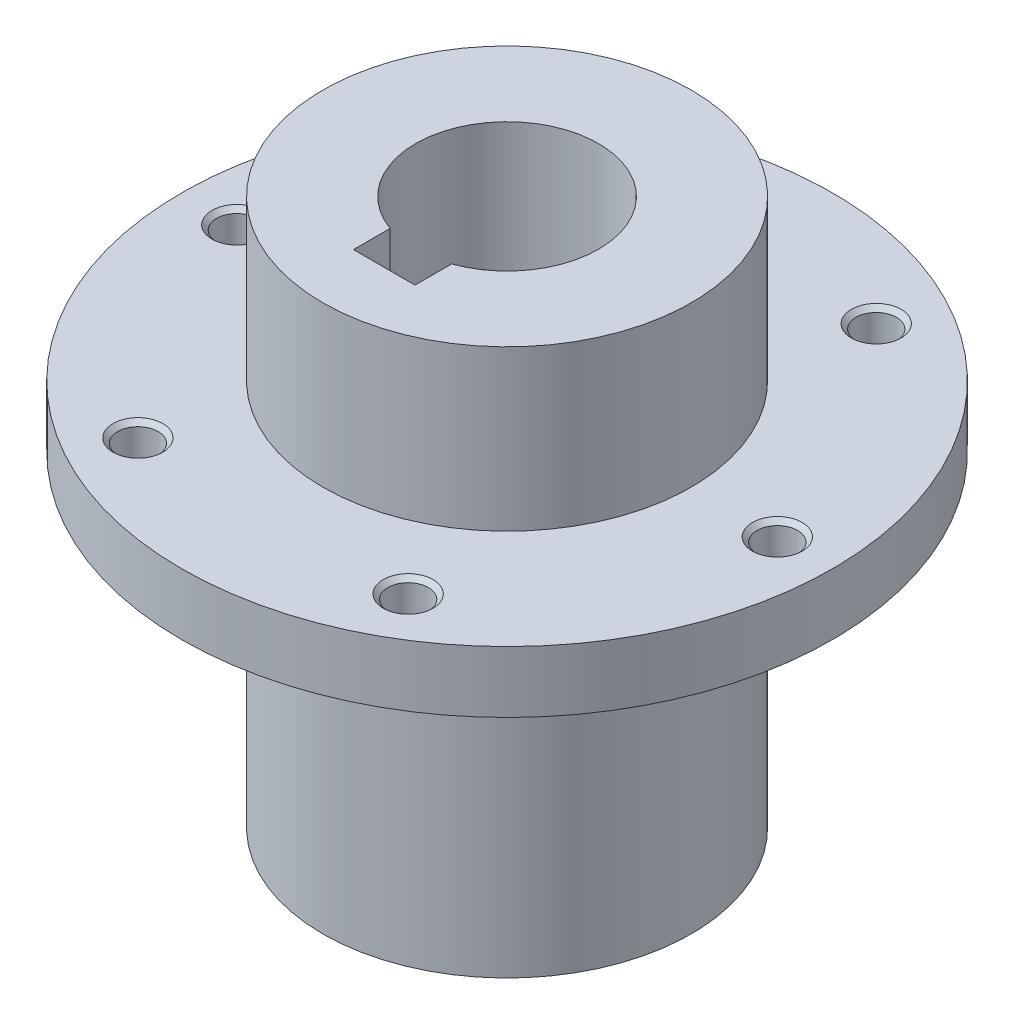
ISO-10303-21;
HEADER;
FILE_DESCRIPTION(('STEP AP214'),'2;1');
FILE_NAME('part.step','',(''),(''),'','','');
FILE_SCHEMA(('AUTOMOTIVE_DESIGN { 1 0 10303 214 1 1 1 1 }'));
ENDSEC;
DATA;
#1=APPLICATION_CONTEXT('core data for automotive mechanical design processes');
#2=APPLICATION_PROTOCOL_DEFINITION('international standard','automotive_design',2000,#1);
#3=PRODUCT_CONTEXT('',#1,'mechanical');
#4=PRODUCT('Part','Part','',(#3));
#5=PRODUCT_RELATED_PRODUCT_CATEGORY('part','',(#4));
#6=PRODUCT_DEFINITION_FORMATION('','',#4);
#7=PRODUCT_DEFINITION_CONTEXT('part definition',#1,'design');
#8=PRODUCT_DEFINITION('design','',#6,#7);
#9=PRODUCT_DEFINITION_SHAPE('','',#8);
#10=(LENGTH_UNIT() NAMED_UNIT(*) SI_UNIT(.MILLI.,.METRE.));
#11=(NAMED_UNIT(*) PLANE_ANGLE_UNIT() SI_UNIT($,.RADIAN.));
#12=(NAMED_UNIT(*) SI_UNIT($,.STERADIAN.) SOLID_ANGLE_UNIT());
#13=UNCERTAINTY_MEASURE_WITH_UNIT(LENGTH_MEASURE(1.E-05),#10,'distance_accuracy_value','');
#14=(GEOMETRIC_REPRESENTATION_CONTEXT(3) GLOBAL_UNCERTAINTY_ASSIGNED_CONTEXT((#13)) GLOBAL_UNIT_ASSIGNED_CONTEXT((#10,
#11,#12)) REPRESENTATION_CONTEXT('',''));
#15=CARTESIAN_POINT('',(0.,0.,0.));
#16=DIRECTION('',(0.,0.,1.));
#17=DIRECTION('',(1.,0.,0.));
#18=AXIS2_PLACEMENT_3D('',#15,#16,#17);
#19=CARTESIAN_POINT('',(0.,0.,0.));
#20=DIRECTION('',(0.,1.,0.));
#21=DIRECTION('',(0.,0.,1.));
#22=AXIS2_PLACEMENT_3D('',#19,#20,#21);
#23=PLANE('',#22);
#24=CARTESIAN_POINT('',(-10.9999999999998,0.,19.0525588832577));
#25=DIRECTION('',(0.,1.,0.));
#26=DIRECTION('',(0.,0.,1.));
#27=AXIS2_PLACEMENT_3D('',#24,#25,#26);
#28=CIRCLE('',#27,1.65);
#29=CARTESIAN_POINT('',(-10.9999999999998,0.,20.7025588832577));
#30=VERTEX_POINT('',#29);
#31=EDGE_CURVE('E120',#30,#30,#28,.F.);
#32=ORIENTED_EDGE('',*,*,#31,.F.);
#33=EDGE_LOOP('',(#32));
#34=FACE_BOUND('',#33,.T.);
#35=CARTESIAN_POINT('',(11.,0.,-19.0525588832577));
#36=DIRECTION('',(0.,1.,0.));
#37=DIRECTION('',(0.,0.,1.));
#38=AXIS2_PLACEMENT_3D('',#35,#36,#37);
#39=CIRCLE('',#38,1.65);
#40=CARTESIAN_POINT('',(11.,0.,-17.4025588832577));
#41=VERTEX_POINT('',#40);
#42=EDGE_CURVE('E147',#41,#41,#39,.F.);
#43=ORIENTED_EDGE('',*,*,#42,.F.);
#44=EDGE_LOOP('',(#43));
#45=FACE_BOUND('',#44,.T.);
#46=CARTESIAN_POINT('',(22.,0.,0.));
#47=DIRECTION('',(0.,1.,0.));
#48=DIRECTION('',(0.,0.,1.));
#49=AXIS2_PLACEMENT_3D('',#46,#47,#48);
#50=CIRCLE('',#49,1.65);
#51=CARTESIAN_POINT('',(22.,0.,1.65));
#52=VERTEX_POINT('',#51);
#53=EDGE_CURVE('E156',#52,#52,#50,.F.);
#54=ORIENTED_EDGE('',*,*,#53,.F.);
#55=EDGE_LOOP('',(#54));
#56=FACE_BOUND('',#55,.T.);
#57=CARTESIAN_POINT('',(0.,0.,0.));
#58=DIRECTION('',(0.,-1.,0.));
#59=DIRECTION('',(0.,0.,-1.));
#60=AXIS2_PLACEMENT_3D('',#57,#58,#59);
#61=CIRCLE('',#60,15.);
#62=CARTESIAN_POINT('',(0.,0.,-15.));
#63=VERTEX_POINT('',#62);
#64=EDGE_CURVE('E168',#63,#63,#61,.T.);
#65=ORIENTED_EDGE('',*,*,#64,.F.);
#66=EDGE_LOOP('',(#65));
#67=FACE_BOUND('',#66,.T.);
#68=CARTESIAN_POINT('',(0.,0.,0.));
#69=DIRECTION('',(0.,1.,0.));
#70=DIRECTION('',(0.,0.,1.));
#71=AXIS2_PLACEMENT_3D('',#68,#69,#70);
#72=CIRCLE('',#71,26.5);
#73=CARTESIAN_POINT('',(0.,0.,26.5));
#74=VERTEX_POINT('',#73);
#75=EDGE_CURVE('E174',#74,#74,#72,.T.);
#76=ORIENTED_EDGE('',*,*,#75,.F.);
#77=EDGE_LOOP('',(#76));
#78=FACE_BOUND('',#77,.T.);
#79=CARTESIAN_POINT('',(-11.0000000000001,0.,-19.0525588832576));
#80=DIRECTION('',(0.,1.,0.));
#81=DIRECTION('',(0.,0.,1.));
#82=AXIS2_PLACEMENT_3D('',#79,#80,#81);
#83=CIRCLE('',#82,1.65);
#84=CARTESIAN_POINT('',(-11.0000000000001,0.,-17.4025588832576));
#85=VERTEX_POINT('',#84);
#86=EDGE_CURVE('E138',#85,#85,#83,.F.);
#87=ORIENTED_EDGE('',*,*,#86,.F.);
#88=EDGE_LOOP('',(#87));
#89=FACE_BOUND('',#88,.T.);
#90=CARTESIAN_POINT('',(-22.,0.,0.));
#91=DIRECTION('',(0.,1.,0.));
#92=DIRECTION('',(0.,0.,1.));
#93=AXIS2_PLACEMENT_3D('',#90,#91,#92);
#94=CIRCLE('',#93,1.65);
#95=CARTESIAN_POINT('',(-22.,0.,1.65));
#96=VERTEX_POINT('',#95);
#97=EDGE_CURVE('E129',#96,#96,#94,.F.);
#98=ORIENTED_EDGE('',*,*,#97,.F.);
#99=EDGE_LOOP('',(#98));
#100=FACE_BOUND('',#99,.T.);
#101=CARTESIAN_POINT('',(11.0000000000002,0.,19.0525588832575));
#102=DIRECTION('',(0.,1.,0.));
#103=DIRECTION('',(0.,0.,1.));
#104=AXIS2_PLACEMENT_3D('',#101,#102,#103);
#105=CIRCLE('',#104,1.65);
#106=CARTESIAN_POINT('',(11.0000000000002,0.,20.7025588832575));
#107=VERTEX_POINT('',#106);
#108=EDGE_CURVE('E111',#107,#107,#105,.F.);
#109=ORIENTED_EDGE('',*,*,#108,.F.);
#110=EDGE_LOOP('',(#109));
#111=FACE_BOUND('',#110,.T.);
#112=ADVANCED_FACE('F38',(#34,#45,#56,#67,#78,#89,#100,#111),#23,.F.);
#113=CARTESIAN_POINT('',(0.,5.,0.));
#114=DIRECTION('',(0.,-1.,0.));
#115=DIRECTION('',(0.,0.,-1.));
#116=AXIS2_PLACEMENT_3D('',#113,#114,#115);
#117=CYLINDRICAL_SURFACE('',#116,26.5);
#118=CARTESIAN_POINT('',(0.,5.,0.));
#119=DIRECTION('',(0.,1.,0.));
#120=DIRECTION('',(0.,0.,1.));
#121=AXIS2_PLACEMENT_3D('',#118,#119,#120);
#122=CIRCLE('',#121,26.5);
#123=CARTESIAN_POINT('',(0.,5.,26.5));
#124=VERTEX_POINT('',#123);
#125=EDGE_CURVE('E177',#124,#124,#122,.T.);
#126=ORIENTED_EDGE('',*,*,#125,.F.);
#127=EDGE_LOOP('',(#126));
#128=FACE_BOUND('',#127,.T.);
#129=ORIENTED_EDGE('',*,*,#75,.T.);
#130=EDGE_LOOP('',(#129));
#131=FACE_BOUND('',#130,.T.);
#132=ADVANCED_FACE('F40',(#128,#131),#117,.T.);
#133=CARTESIAN_POINT('',(0.,5.,0.));
#134=DIRECTION('',(0.,1.,0.));
#135=DIRECTION('',(0.,0.,1.));
#136=AXIS2_PLACEMENT_3D('',#133,#134,#135);
#137=PLANE('',#136);
#138=CARTESIAN_POINT('',(11.0000000000002,5.,19.0525588832575));
#139=DIRECTION('',(0.,1.,0.));
#140=DIRECTION('',(0.,0.,1.));
#141=AXIS2_PLACEMENT_3D('',#138,#139,#140);
#142=CIRCLE('',#141,2.025);
#143=CARTESIAN_POINT('',(11.0000000000002,5.,21.0775588832575));
#144=VERTEX_POINT('',#143);
#145=EDGE_CURVE('E110',#144,#144,#142,.T.);
#146=ORIENTED_EDGE('',*,*,#145,.F.);
#147=EDGE_LOOP('',(#146));
#148=FACE_BOUND('',#147,.T.);
#149=CARTESIAN_POINT('',(-10.9999999999998,5.,19.0525588832577));
#150=DIRECTION('',(0.,1.,0.));
#151=DIRECTION('',(0.,0.,1.));
#152=AXIS2_PLACEMENT_3D('',#149,#150,#151);
#153=CIRCLE('',#152,2.025);
#154=CARTESIAN_POINT('',(-10.9999999999998,5.,21.0775588832577));
#155=VERTEX_POINT('',#154);
#156=EDGE_CURVE('E114',#155,#155,#153,.T.);
#157=ORIENTED_EDGE('',*,*,#156,.F.);
#158=EDGE_LOOP('',(#157));
#159=FACE_BOUND('',#158,.T.);
#160=CARTESIAN_POINT('',(-22.,5.,0.));
#161=DIRECTION('',(0.,1.,0.));
#162=DIRECTION('',(0.,0.,1.));
#163=AXIS2_PLACEMENT_3D('',#160,#161,#162);
#164=CIRCLE('',#163,2.025);
#165=CARTESIAN_POINT('',(-22.,5.,2.025));
#166=VERTEX_POINT('',#165);
#167=EDGE_CURVE('E123',#166,#166,#164,.T.);
#168=ORIENTED_EDGE('',*,*,#167,.F.);
#169=EDGE_LOOP('',(#168));
#170=FACE_BOUND('',#169,.T.);
#171=CARTESIAN_POINT('',(-11.0000000000001,5.,-19.0525588832576));
#172=DIRECTION('',(0.,1.,0.));
#173=DIRECTION('',(0.,0.,1.));
#174=AXIS2_PLACEMENT_3D('',#171,#172,#173);
#175=CIRCLE('',#174,2.025);
#176=CARTESIAN_POINT('',(-11.0000000000001,5.,-17.0275588832576));
#177=VERTEX_POINT('',#176);
#178=EDGE_CURVE('E132',#177,#177,#175,.T.);
#179=ORIENTED_EDGE('',*,*,#178,.F.);
#180=EDGE_LOOP('',(#179));
#181=FACE_BOUND('',#180,.T.);
#182=CARTESIAN_POINT('',(11.,5.,-19.0525588832577));
#183=DIRECTION('',(0.,1.,0.));
#184=DIRECTION('',(0.,0.,1.));
#185=AXIS2_PLACEMENT_3D('',#182,#183,#184);
#186=CIRCLE('',#185,2.025);
#187=CARTESIAN_POINT('',(11.,5.,-17.0275588832577));
#188=VERTEX_POINT('',#187);
#189=EDGE_CURVE('E141',#188,#188,#186,.T.);
#190=ORIENTED_EDGE('',*,*,#189,.F.);
#191=EDGE_LOOP('',(#190));
#192=FACE_BOUND('',#191,.T.);
#193=CARTESIAN_POINT('',(22.,5.,0.));
#194=DIRECTION('',(0.,1.,0.));
#195=DIRECTION('',(0.,0.,1.));
#196=AXIS2_PLACEMENT_3D('',#193,#194,#195);
#197=CIRCLE('',#196,2.025);
#198=CARTESIAN_POINT('',(22.,5.,2.025));
#199=VERTEX_POINT('',#198);
#200=EDGE_CURVE('E150',#199,#199,#197,.T.);
#201=ORIENTED_EDGE('',*,*,#200,.F.);
#202=EDGE_LOOP('',(#201));
#203=FACE_BOUND('',#202,.T.);
#204=CARTESIAN_POINT('',(0.,5.,0.));
#205=DIRECTION('',(0.,1.,0.));
#206=DIRECTION('',(0.,0.,1.));
#207=AXIS2_PLACEMENT_3D('',#204,#205,#206);
#208=CIRCLE('',#207,15.);
#209=CARTESIAN_POINT('',(0.,5.,-15.));
#210=VERTEX_POINT('',#209);
#211=EDGE_CURVE('E171',#210,#210,#208,.T.);
#212=ORIENTED_EDGE('',*,*,#211,.F.);
#213=EDGE_LOOP('',(#212));
#214=FACE_BOUND('',#213,.T.);
#215=ORIENTED_EDGE('',*,*,#125,.T.);
#216=EDGE_LOOP('',(#215));
#217=FACE_BOUND('',#216,.T.);
#218=ADVANCED_FACE('F197',(#148,#159,#170,#181,#192,#203,#214,#217),#137,.T.);
#219=CARTESIAN_POINT('',(0.,18.,0.));
#220=DIRECTION('',(0.,-1.,0.));
#221=DIRECTION('',(0.,0.,-1.));
#222=AXIS2_PLACEMENT_3D('',#219,#220,#221);
#223=CYLINDRICAL_SURFACE('',#222,15.);
#224=CARTESIAN_POINT('',(0.,18.,0.));
#225=DIRECTION('',(0.,1.,0.));
#226=DIRECTION('',(0.,0.,1.));
#227=AXIS2_PLACEMENT_3D('',#224,#225,#226);
#228=CIRCLE('',#227,15.);
#229=CARTESIAN_POINT('',(0.,18.,-15.));
#230=VERTEX_POINT('',#229);
#231=EDGE_CURVE('E167',#230,#230,#228,.T.);
#232=CARTESIAN_POINT('',(0.,18.,-15.));
#233=CARTESIAN_POINT('',(0.,17.8645833333333,-15.));
#234=CARTESIAN_POINT('',(0.,17.7291666666667,-15.));
#235=CARTESIAN_POINT('',(0.,17.4583333333333,-15.));
#236=CARTESIAN_POINT('',(0.,17.3229166666667,-15.));
#237=CARTESIAN_POINT('',(0.,17.0520833333333,-15.));
#238=CARTESIAN_POINT('',(0.,16.9166666666667,-15.));
#239=CARTESIAN_POINT('',(0.,16.6458333333333,-15.));
#240=CARTESIAN_POINT('',(0.,16.5104166666667,-15.));
#241=CARTESIAN_POINT('',(0.,16.2395833333333,-15.));
#242=CARTESIAN_POINT('',(0.,16.1041666666667,-15.));
#243=CARTESIAN_POINT('',(0.,15.8333333333333,-15.));
#244=CARTESIAN_POINT('',(0.,15.6979166666667,-15.));
#245=CARTESIAN_POINT('',(0.,15.4270833333333,-15.));
#246=CARTESIAN_POINT('',(0.,15.2916666666667,-15.));
#247=CARTESIAN_POINT('',(0.,15.0208333333333,-15.));
#248=CARTESIAN_POINT('',(0.,14.8854166666667,-15.));
#249=CARTESIAN_POINT('',(0.,14.6145833333333,-15.));
#250=CARTESIAN_POINT('',(0.,14.4791666666667,-15.));
#251=CARTESIAN_POINT('',(0.,14.2083333333333,-15.));
#252=CARTESIAN_POINT('',(0.,14.0729166666667,-15.));
#253=CARTESIAN_POINT('',(0.,13.8020833333333,-15.));
#254=CARTESIAN_POINT('',(0.,13.6666666666667,-15.));
#255=CARTESIAN_POINT('',(0.,13.3958333333333,-15.));
#256=CARTESIAN_POINT('',(0.,13.2604166666667,-15.));
#257=CARTESIAN_POINT('',(0.,12.9895833333333,-15.));
#258=CARTESIAN_POINT('',(0.,12.8541666666667,-15.));
#259=CARTESIAN_POINT('',(0.,12.5833333333333,-15.));
#260=CARTESIAN_POINT('',(0.,12.4479166666667,-15.));
#261=CARTESIAN_POINT('',(0.,12.1770833333333,-15.));
#262=CARTESIAN_POINT('',(0.,12.0416666666667,-15.));
#263=CARTESIAN_POINT('',(0.,11.7708333333333,-15.));
#264=CARTESIAN_POINT('',(0.,11.6354166666667,-15.));
#265=CARTESIAN_POINT('',(0.,11.3645833333333,-15.));
#266=CARTESIAN_POINT('',(0.,11.2291666666667,-15.));
#267=CARTESIAN_POINT('',(0.,10.9583333333333,-15.));
#268=CARTESIAN_POINT('',(0.,10.8229166666667,-15.));
#269=CARTESIAN_POINT('',(0.,10.5520833333333,-15.));
#270=CARTESIAN_POINT('',(0.,10.4166666666667,-15.));
#271=CARTESIAN_POINT('',(0.,10.1458333333333,-15.));
#272=CARTESIAN_POINT('',(0.,10.0104166666667,-15.));
#273=CARTESIAN_POINT('',(0.,9.73958333333333,-15.));
#274=CARTESIAN_POINT('',(0.,9.60416666666667,-15.));
#275=CARTESIAN_POINT('',(0.,9.33333333333333,-15.));
#276=CARTESIAN_POINT('',(0.,9.19791666666667,-15.));
#277=CARTESIAN_POINT('',(0.,8.92708333333333,-15.));
#278=CARTESIAN_POINT('',(0.,8.79166666666667,-15.));
#279=CARTESIAN_POINT('',(0.,8.52083333333333,-15.));
#280=CARTESIAN_POINT('',(0.,8.38541666666667,-15.));
#281=CARTESIAN_POINT('',(0.,8.11458333333333,-15.));
#282=CARTESIAN_POINT('',(0.,7.97916666666667,-15.));
#283=CARTESIAN_POINT('',(0.,7.70833333333333,-15.));
#284=CARTESIAN_POINT('',(0.,7.57291666666667,-15.));
#285=CARTESIAN_POINT('',(0.,7.30208333333333,-15.));
#286=CARTESIAN_POINT('',(0.,7.16666666666667,-15.));
#287=CARTESIAN_POINT('',(0.,6.89583333333333,-15.));
#288=CARTESIAN_POINT('',(0.,6.76041666666667,-15.));
#289=CARTESIAN_POINT('',(0.,6.48958333333333,-15.));
#290=CARTESIAN_POINT('',(0.,6.35416666666667,-15.));
#291=CARTESIAN_POINT('',(0.,6.08333333333333,-15.));
#292=CARTESIAN_POINT('',(0.,5.94791666666667,-15.));
#293=CARTESIAN_POINT('',(0.,5.67708333333333,-15.));
#294=CARTESIAN_POINT('',(0.,5.54166666666667,-15.));
#295=CARTESIAN_POINT('',(0.,5.27083333333333,-15.));
#296=CARTESIAN_POINT('',(0.,5.13541666666667,-15.));
#297=CARTESIAN_POINT('',(0.,5.,-15.));
#298=B_SPLINE_CURVE_WITH_KNOTS('',3,(#232,#233,#234,#235,#236,#237,#238,#239,#240,#241,#242,
#243,#244,#245,#246,#247,#248,#249,#250,#251,#252,#253,#254,#255,#256,#257,#258,#259,#260,#261,
#262,#263,#264,#265,#266,#267,#268,#269,#270,#271,#272,#273,#274,#275,#276,#277,#278,#279,#280,
#281,#282,#283,#284,#285,#286,#287,#288,#289,#290,#291,#292,#293,#294,#295,#296,#297),
.UNSPECIFIED.,.F.,.F.,(4,2,2,2,2,2,2,2,2,2,2,2,2,2,2,2,2,2,2,2,2,2,2,2,2,2,2,2,2,2,2,2,4),(0.,
0.40625,0.812500000000001,1.21875,1.625,2.03125,2.4375,2.84375,3.25,3.65625,4.0625,4.46875,
4.875,5.28125,5.6875,6.09375,6.5,6.90625,7.3125,7.71875,8.125,8.53125,8.9375,9.34375,9.75,
10.15625,10.5625,10.96875,11.375,11.78125,12.1875,12.59375,13.),.UNSPECIFIED.);
#299=EDGE_CURVE('BSEAM191',#230,#210,#298,.T.);
#300=ORIENTED_EDGE('',*,*,#231,.F.);
#301=ORIENTED_EDGE('',*,*,#211,.T.);
#302=ORIENTED_EDGE('',*,*,#299,.T.);
#303=ORIENTED_EDGE('',*,*,#299,.F.);
#304=EDGE_LOOP('',(#300,#302,#301,#303));
#305=FACE_BOUND('',#304,.T.);
#306=ADVANCED_FACE('F191',(#305),#223,.T.);
#307=CARTESIAN_POINT('',(0.,18.,0.));
#308=DIRECTION('',(0.,1.,0.));
#309=DIRECTION('',(0.,0.,1.));
#310=AXIS2_PLACEMENT_3D('',#307,#308,#309);
#311=PLANE('',#310);
#312=DIRECTION('',(0.,0.,-1.));
#313=VECTOR('',#312,1.);
#314=CARTESIAN_POINT('',(2.505,18.,10.));
#315=LINE('',#314,#313);
#316=CARTESIAN_POINT('',(2.505,18.,10.));
#317=VERTEX_POINT('',#316);
#318=CARTESIAN_POINT('',(2.505,18.,7.0162294004686));
#319=VERTEX_POINT('',#318);
#320=EDGE_CURVE('E61',#317,#319,#315,.T.);
#321=ORIENTED_EDGE('',*,*,#320,.F.);
#322=DIRECTION('',(1.,0.,0.));
#323=VECTOR('',#322,1.);
#324=CARTESIAN_POINT('',(-2.505,18.,10.));
#325=LINE('',#324,#323);
#326=CARTESIAN_POINT('',(-2.505,18.,10.));
#327=VERTEX_POINT('',#326);
#328=EDGE_CURVE('E92',#327,#317,#325,.T.);
#329=ORIENTED_EDGE('',*,*,#328,.F.);
#330=DIRECTION('',(0.,0.,1.));
#331=VECTOR('',#330,1.);
#332=CARTESIAN_POINT('',(-2.505,18.,10.));
#333=LINE('',#332,#331);
#334=CARTESIAN_POINT('',(-2.505,18.,7.0162294004686));
#335=VERTEX_POINT('',#334);
#336=EDGE_CURVE('E100',#335,#327,#333,.T.);
#337=ORIENTED_EDGE('',*,*,#336,.F.);
#338=CARTESIAN_POINT('',(0.,18.,0.));
#339=DIRECTION('',(0.,1.,0.));
#340=DIRECTION('',(0.,0.,1.));
#341=AXIS2_PLACEMENT_3D('',#338,#339,#340);
#342=CIRCLE('',#341,7.45);
#343=EDGE_CURVE('E105',#319,#335,#342,.T.);
#344=ORIENTED_EDGE('',*,*,#343,.F.);
#345=EDGE_LOOP('',(#321,#329,#337,#344));
#346=FACE_BOUND('',#345,.T.);
#347=ORIENTED_EDGE('',*,*,#231,.T.);
#348=EDGE_LOOP('',(#347));
#349=FACE_BOUND('',#348,.T.);
#350=ADVANCED_FACE('F187',(#346,#349),#311,.T.);
#351=CARTESIAN_POINT('',(0.,-26.5,0.));
#352=DIRECTION('',(0.,1.,0.));
#353=DIRECTION('',(0.,0.,1.));
#354=AXIS2_PLACEMENT_3D('',#351,#352,#353);
#355=CYLINDRICAL_SURFACE('',#354,15.);
#356=CARTESIAN_POINT('',(0.,-26.5,0.));
#357=DIRECTION('',(0.,-1.,0.));
#358=DIRECTION('',(0.,0.,-1.));
#359=AXIS2_PLACEMENT_3D('',#356,#357,#358);
#360=CIRCLE('',#359,15.);
#361=CARTESIAN_POINT('',(0.,-26.5,-15.));
#362=VERTEX_POINT('',#361);
#363=EDGE_CURVE('E159',#362,#362,#360,.T.);
#364=ORIENTED_EDGE('',*,*,#363,.F.);
#365=EDGE_LOOP('',(#364));
#366=FACE_BOUND('',#365,.T.);
#367=ORIENTED_EDGE('',*,*,#64,.T.);
#368=EDGE_LOOP('',(#367));
#369=FACE_BOUND('',#368,.T.);
#370=ADVANCED_FACE('F190',(#366,#369),#355,.T.);
#371=CARTESIAN_POINT('',(0.,-26.5,0.));
#372=DIRECTION('',(0.,-1.,0.));
#373=DIRECTION('',(0.,0.,-1.));
#374=AXIS2_PLACEMENT_3D('',#371,#372,#373);
#375=PLANE('',#374);
#376=DIRECTION('',(0.,0.,-1.));
#377=VECTOR('',#376,1.);
#378=CARTESIAN_POINT('',(2.505,-26.5,10.));
#379=LINE('',#378,#377);
#380=CARTESIAN_POINT('',(2.505,-26.5,10.));
#381=VERTEX_POINT('',#380);
#382=CARTESIAN_POINT('',(2.505,-26.5,7.0162294004686));
#383=VERTEX_POINT('',#382);
#384=EDGE_CURVE('E77',#381,#383,#379,.T.);
#385=ORIENTED_EDGE('',*,*,#384,.T.);
#386=CARTESIAN_POINT('',(0.,-26.5,0.));
#387=DIRECTION('',(0.,-1.,0.));
#388=DIRECTION('',(0.,0.,-1.));
#389=AXIS2_PLACEMENT_3D('',#386,#387,#388);
#390=CIRCLE('',#389,7.45);
#391=CARTESIAN_POINT('',(-2.505,-26.5,7.0162294004686));
#392=VERTEX_POINT('',#391);
#393=EDGE_CURVE('E108',#383,#392,#390,.F.);
#394=ORIENTED_EDGE('',*,*,#393,.T.);
#395=DIRECTION('',(0.,0.,1.));
#396=VECTOR('',#395,1.);
#397=CARTESIAN_POINT('',(-2.505,-26.5,10.));
#398=LINE('',#397,#396);
#399=CARTESIAN_POINT('',(-2.505,-26.5,10.));
#400=VERTEX_POINT('',#399);
#401=EDGE_CURVE('E53',#392,#400,#398,.T.);
#402=ORIENTED_EDGE('',*,*,#401,.T.);
#403=DIRECTION('',(1.,0.,0.));
#404=VECTOR('',#403,1.);
#405=CARTESIAN_POINT('',(-2.505,-26.5,10.));
#406=LINE('',#405,#404);
#407=EDGE_CURVE('E90',#400,#381,#406,.T.);
#408=ORIENTED_EDGE('',*,*,#407,.T.);
#409=EDGE_LOOP('',(#385,#394,#402,#408));
#410=FACE_BOUND('',#409,.T.);
#411=ORIENTED_EDGE('',*,*,#363,.T.);
#412=EDGE_LOOP('',(#411));
#413=FACE_BOUND('',#412,.T.);
#414=ADVANCED_FACE('F94',(#410,#413),#375,.T.);
#415=CARTESIAN_POINT('',(22.,5.,0.));
#416=DIRECTION('',(0.,1.,0.));
#417=DIRECTION('',(0.,0.,1.));
#418=AXIS2_PLACEMENT_3D('',#415,#416,#417);
#419=CYLINDRICAL_SURFACE('',#418,1.65);
#420=ORIENTED_EDGE('',*,*,#53,.T.);
#421=EDGE_LOOP('',(#420));
#422=FACE_BOUND('',#421,.T.);
#423=CARTESIAN_POINT('',(22.,4.625,0.));
#424=DIRECTION('',(0.,1.,0.));
#425=DIRECTION('',(0.,0.,1.));
#426=AXIS2_PLACEMENT_3D('',#423,#424,#425);
#427=CIRCLE('',#426,1.65);
#428=CARTESIAN_POINT('',(22.,4.625,1.65));
#429=VERTEX_POINT('',#428);
#430=EDGE_CURVE('E160',#429,#429,#427,.T.);
#431=ORIENTED_EDGE('',*,*,#430,.T.);
#432=EDGE_LOOP('',(#431));
#433=FACE_BOUND('',#432,.T.);
#434=ADVANCED_FACE('F246',(#422,#433),#419,.F.);
#435=CARTESIAN_POINT('',(22.,5.,0.));
#436=DIRECTION('',(0.,1.,0.));
#437=DIRECTION('',(0.,0.,1.));
#438=AXIS2_PLACEMENT_3D('',#435,#436,#437);
#439=CONICAL_SURFACE('',#438,2.025,0.78539816339745);
#440=ORIENTED_EDGE('',*,*,#430,.F.);
#441=EDGE_LOOP('',(#440));
#442=FACE_BOUND('',#441,.T.);
#443=ORIENTED_EDGE('',*,*,#200,.T.);
#444=EDGE_LOOP('',(#443));
#445=FACE_BOUND('',#444,.T.);
#446=ADVANCED_FACE('F243',(#442,#445),#439,.F.);
#447=CARTESIAN_POINT('',(11.,5.,-19.0525588832577));
#448=DIRECTION('',(0.,1.,0.));
#449=DIRECTION('',(0.,0.,1.));
#450=AXIS2_PLACEMENT_3D('',#447,#448,#449);
#451=CYLINDRICAL_SURFACE('',#450,1.65);
#452=ORIENTED_EDGE('',*,*,#42,.T.);
#453=EDGE_LOOP('',(#452));
#454=FACE_BOUND('',#453,.T.);
#455=CARTESIAN_POINT('',(11.,4.625,-19.0525588832577));
#456=DIRECTION('',(0.,1.,0.));
#457=DIRECTION('',(0.,0.,1.));
#458=AXIS2_PLACEMENT_3D('',#455,#456,#457);
#459=CIRCLE('',#458,1.65);
#460=CARTESIAN_POINT('',(11.,4.625,-17.4025588832577));
#461=VERTEX_POINT('',#460);
#462=EDGE_CURVE('E151',#461,#461,#459,.T.);
#463=ORIENTED_EDGE('',*,*,#462,.T.);
#464=EDGE_LOOP('',(#463));
#465=FACE_BOUND('',#464,.T.);
#466=ADVANCED_FACE('F245',(#454,#465),#451,.F.);
#467=CARTESIAN_POINT('',(11.,5.,-19.0525588832577));
#468=DIRECTION('',(0.,1.,0.));
#469=DIRECTION('',(0.,0.,1.));
#470=AXIS2_PLACEMENT_3D('',#467,#468,#469);
#471=CONICAL_SURFACE('',#470,2.025,0.78539816339745);
#472=ORIENTED_EDGE('',*,*,#462,.F.);
#473=EDGE_LOOP('',(#472));
#474=FACE_BOUND('',#473,.T.);
#475=ORIENTED_EDGE('',*,*,#189,.T.);
#476=EDGE_LOOP('',(#475));
#477=FACE_BOUND('',#476,.T.);
#478=ADVANCED_FACE('F253',(#474,#477),#471,.F.);
#479=CARTESIAN_POINT('',(-11.0000000000001,5.,-19.0525588832576));
#480=DIRECTION('',(0.,1.,0.));
#481=DIRECTION('',(0.,0.,1.));
#482=AXIS2_PLACEMENT_3D('',#479,#480,#481);
#483=CYLINDRICAL_SURFACE('',#482,1.65);
#484=ORIENTED_EDGE('',*,*,#86,.T.);
#485=EDGE_LOOP('',(#484));
#486=FACE_BOUND('',#485,.T.);
#487=CARTESIAN_POINT('',(-11.0000000000001,4.625,-19.0525588832576));
#488=DIRECTION('',(0.,1.,0.));
#489=DIRECTION('',(0.,0.,1.));
#490=AXIS2_PLACEMENT_3D('',#487,#488,#489);
#491=CIRCLE('',#490,1.65);
#492=CARTESIAN_POINT('',(-11.0000000000001,4.625,-17.4025588832576));
#493=VERTEX_POINT('',#492);
#494=EDGE_CURVE('E142',#493,#493,#491,.T.);
#495=ORIENTED_EDGE('',*,*,#494,.T.);
#496=EDGE_LOOP('',(#495));
#497=FACE_BOUND('',#496,.T.);
#498=ADVANCED_FACE('F330',(#486,#497),#483,.F.);
#499=CARTESIAN_POINT('',(-11.0000000000001,5.,-19.0525588832576));
#500=DIRECTION('',(0.,1.,0.));
#501=DIRECTION('',(0.,0.,1.));
#502=AXIS2_PLACEMENT_3D('',#499,#500,#501);
#503=CONICAL_SURFACE('',#502,2.025,0.785398163397452);
#504=ORIENTED_EDGE('',*,*,#494,.F.);
#505=EDGE_LOOP('',(#504));
#506=FACE_BOUND('',#505,.T.);
#507=ORIENTED_EDGE('',*,*,#178,.T.);
#508=EDGE_LOOP('',(#507));
#509=FACE_BOUND('',#508,.T.);
#510=ADVANCED_FACE('F335',(#506,#509),#503,.F.);
#511=CARTESIAN_POINT('',(-22.,5.,0.));
#512=DIRECTION('',(0.,1.,0.));
#513=DIRECTION('',(0.,0.,1.));
#514=AXIS2_PLACEMENT_3D('',#511,#512,#513);
#515=CYLINDRICAL_SURFACE('',#514,1.65);
#516=ORIENTED_EDGE('',*,*,#97,.T.);
#517=EDGE_LOOP('',(#516));
#518=FACE_BOUND('',#517,.T.);
#519=CARTESIAN_POINT('',(-22.,4.625,0.));
#520=DIRECTION('',(0.,1.,0.));
#521=DIRECTION('',(0.,0.,1.));
#522=AXIS2_PLACEMENT_3D('',#519,#520,#521);
#523=CIRCLE('',#522,1.65);
#524=CARTESIAN_POINT('',(-22.,4.625,1.65));
#525=VERTEX_POINT('',#524);
#526=EDGE_CURVE('E133',#525,#525,#523,.T.);
#527=ORIENTED_EDGE('',*,*,#526,.T.);
#528=EDGE_LOOP('',(#527));
#529=FACE_BOUND('',#528,.T.);
#530=ADVANCED_FACE('F342',(#518,#529),#515,.F.);
#531=CARTESIAN_POINT('',(-22.,5.,0.));
#532=DIRECTION('',(0.,1.,0.));
#533=DIRECTION('',(0.,0.,1.));
#534=AXIS2_PLACEMENT_3D('',#531,#532,#533);
#535=CONICAL_SURFACE('',#534,2.025,0.78539816339745);
#536=ORIENTED_EDGE('',*,*,#526,.F.);
#537=EDGE_LOOP('',(#536));
#538=FACE_BOUND('',#537,.T.);
#539=ORIENTED_EDGE('',*,*,#167,.T.);
#540=EDGE_LOOP('',(#539));
#541=FACE_BOUND('',#540,.T.);
#542=ADVANCED_FACE('F317',(#538,#541),#535,.F.);
#543=CARTESIAN_POINT('',(-10.9999999999998,5.,19.0525588832577));
#544=DIRECTION('',(0.,1.,0.));
#545=DIRECTION('',(0.,0.,1.));
#546=AXIS2_PLACEMENT_3D('',#543,#544,#545);
#547=CYLINDRICAL_SURFACE('',#546,1.65);
#548=ORIENTED_EDGE('',*,*,#31,.T.);
#549=EDGE_LOOP('',(#548));
#550=FACE_BOUND('',#549,.T.);
#551=CARTESIAN_POINT('',(-10.9999999999998,4.625,19.0525588832577));
#552=DIRECTION('',(0.,1.,0.));
#553=DIRECTION('',(0.,0.,1.));
#554=AXIS2_PLACEMENT_3D('',#551,#552,#553);
#555=CIRCLE('',#554,1.65);
#556=CARTESIAN_POINT('',(-10.9999999999998,4.625,20.7025588832577));
#557=VERTEX_POINT('',#556);
#558=EDGE_CURVE('E124',#557,#557,#555,.T.);
#559=ORIENTED_EDGE('',*,*,#558,.T.);
#560=EDGE_LOOP('',(#559));
#561=FACE_BOUND('',#560,.T.);
#562=ADVANCED_FACE('F306',(#550,#561),#547,.F.);
#563=CARTESIAN_POINT('',(-10.9999999999998,5.,19.0525588832577));
#564=DIRECTION('',(0.,1.,0.));
#565=DIRECTION('',(0.,0.,1.));
#566=AXIS2_PLACEMENT_3D('',#563,#564,#565);
#567=CONICAL_SURFACE('',#566,2.025,0.785398163397452);
#568=ORIENTED_EDGE('',*,*,#558,.F.);
#569=EDGE_LOOP('',(#568));
#570=FACE_BOUND('',#569,.T.);
#571=ORIENTED_EDGE('',*,*,#156,.T.);
#572=EDGE_LOOP('',(#571));
#573=FACE_BOUND('',#572,.T.);
#574=ADVANCED_FACE('F224',(#570,#573),#567,.F.);
#575=CARTESIAN_POINT('',(11.0000000000002,5.,19.0525588832575));
#576=DIRECTION('',(0.,1.,0.));
#577=DIRECTION('',(0.,0.,1.));
#578=AXIS2_PLACEMENT_3D('',#575,#576,#577);
#579=CYLINDRICAL_SURFACE('',#578,1.65);
#580=ORIENTED_EDGE('',*,*,#108,.T.);
#581=EDGE_LOOP('',(#580));
#582=FACE_BOUND('',#581,.T.);
#583=CARTESIAN_POINT('',(11.0000000000002,4.625,19.0525588832575));
#584=DIRECTION('',(0.,1.,0.));
#585=DIRECTION('',(0.,0.,1.));
#586=AXIS2_PLACEMENT_3D('',#583,#584,#585);
#587=CIRCLE('',#586,1.65);
#588=CARTESIAN_POINT('',(11.0000000000002,4.625,20.7025588832575));
#589=VERTEX_POINT('',#588);
#590=EDGE_CURVE('E115',#589,#589,#587,.T.);
#591=ORIENTED_EDGE('',*,*,#590,.T.);
#592=EDGE_LOOP('',(#591));
#593=FACE_BOUND('',#592,.T.);
#594=ADVANCED_FACE('F220',(#582,#593),#579,.F.);
#595=CARTESIAN_POINT('',(11.0000000000002,5.,19.0525588832575));
#596=DIRECTION('',(0.,1.,0.));
#597=DIRECTION('',(0.,0.,1.));
#598=AXIS2_PLACEMENT_3D('',#595,#596,#597);
#599=CONICAL_SURFACE('',#598,2.025,0.785398163397452);
#600=ORIENTED_EDGE('',*,*,#590,.F.);
#601=EDGE_LOOP('',(#600));
#602=FACE_BOUND('',#601,.T.);
#603=ORIENTED_EDGE('',*,*,#145,.T.);
#604=EDGE_LOOP('',(#603));
#605=FACE_BOUND('',#604,.T.);
#606=ADVANCED_FACE('F223',(#602,#605),#599,.F.);
#607=CARTESIAN_POINT('',(0.,-47.5717820793591,0.));
#608=DIRECTION('',(0.,1.,0.));
#609=DIRECTION('',(0.,0.,1.));
#610=AXIS2_PLACEMENT_3D('',#607,#608,#609);
#611=CYLINDRICAL_SURFACE('',#610,7.45);
#612=ORIENTED_EDGE('',*,*,#393,.F.);
#613=DIRECTION('',(0.,1.,0.));
#614=VECTOR('',#613,1.);
#615=CARTESIAN_POINT('',(2.505,-47.5717820793591,7.0162294004686));
#616=LINE('',#615,#614);
#617=EDGE_CURVE('E11',#383,#319,#616,.T.);
#618=ORIENTED_EDGE('',*,*,#617,.T.);
#619=ORIENTED_EDGE('',*,*,#343,.T.);
#620=DIRECTION('',(0.,1.,0.));
#621=VECTOR('',#620,1.);
#622=CARTESIAN_POINT('',(-2.505,-47.5717820793591,7.0162294004686));
#623=LINE('',#622,#621);
#624=EDGE_CURVE('E46',#335,#392,#623,.F.);
#625=ORIENTED_EDGE('',*,*,#624,.T.);
#626=EDGE_LOOP('',(#612,#618,#619,#625));
#627=FACE_BOUND('',#626,.T.);
#628=ADVANCED_FACE('F182',(#627),#611,.F.);
#629=CARTESIAN_POINT('',(2.505,-33.5781424116784,10.));
#630=DIRECTION('',(1.,0.,0.));
#631=DIRECTION('',(0.,0.,-1.));
#632=AXIS2_PLACEMENT_3D('',#629,#630,#631);
#633=PLANE('',#632);
#634=ORIENTED_EDGE('',*,*,#384,.F.);
#635=DIRECTION('',(0.,1.,0.));
#636=VECTOR('',#635,1.);
#637=CARTESIAN_POINT('',(2.505,-33.5781424116784,10.));
#638=LINE('',#637,#636);
#639=EDGE_CURVE('E80',#381,#317,#638,.T.);
#640=ORIENTED_EDGE('',*,*,#639,.T.);
#641=ORIENTED_EDGE('',*,*,#320,.T.);
#642=ORIENTED_EDGE('',*,*,#617,.F.);
#643=EDGE_LOOP('',(#634,#640,#641,#642));
#644=FACE_BOUND('',#643,.T.);
#645=ADVANCED_FACE('F79',(#644),#633,.F.);
#646=CARTESIAN_POINT('',(-2.505,-33.5781424116784,10.));
#647=DIRECTION('',(-1.,0.,0.));
#648=DIRECTION('',(0.,0.,1.));
#649=AXIS2_PLACEMENT_3D('',#646,#647,#648);
#650=PLANE('',#649);
#651=ORIENTED_EDGE('',*,*,#336,.T.);
#652=DIRECTION('',(0.,1.,0.));
#653=VECTOR('',#652,1.);
#654=CARTESIAN_POINT('',(-2.505,-33.5781424116784,10.));
#655=LINE('',#654,#653);
#656=EDGE_CURVE('E102',#400,#327,#655,.T.);
#657=ORIENTED_EDGE('',*,*,#656,.F.);
#658=ORIENTED_EDGE('',*,*,#401,.F.);
#659=ORIENTED_EDGE('',*,*,#624,.F.);
#660=EDGE_LOOP('',(#651,#657,#658,#659));
#661=FACE_BOUND('',#660,.T.);
#662=ADVANCED_FACE('F185',(#661),#650,.F.);
#663=CARTESIAN_POINT('',(-2.505,-33.5781424116784,10.));
#664=DIRECTION('',(0.,0.,1.));
#665=DIRECTION('',(1.,0.,0.));
#666=AXIS2_PLACEMENT_3D('',#663,#664,#665);
#667=PLANE('',#666);
#668=ORIENTED_EDGE('',*,*,#656,.T.);
#669=ORIENTED_EDGE('',*,*,#328,.T.);
#670=ORIENTED_EDGE('',*,*,#639,.F.);
#671=ORIENTED_EDGE('',*,*,#407,.F.);
#672=EDGE_LOOP('',(#668,#669,#670,#671));
#673=FACE_BOUND('',#672,.T.);
#674=ADVANCED_FACE('F89',(#673),#667,.F.);
#675=CLOSED_SHELL('',(#112,#132,#218,#306,#350,#370,#414,#434,#446,#466,#478,#498,#510,#530,
#542,#562,#574,#594,#606,#628,#645,#662,#674));
#676=MANIFOLD_SOLID_BREP('B2',#675);
#677=ADVANCED_BREP_SHAPE_REPRESENTATION('',(#18,#676),#14);
#678=SHAPE_DEFINITION_REPRESENTATION(#9,#677);
ENDSEC;
END-ISO-10303-21;
